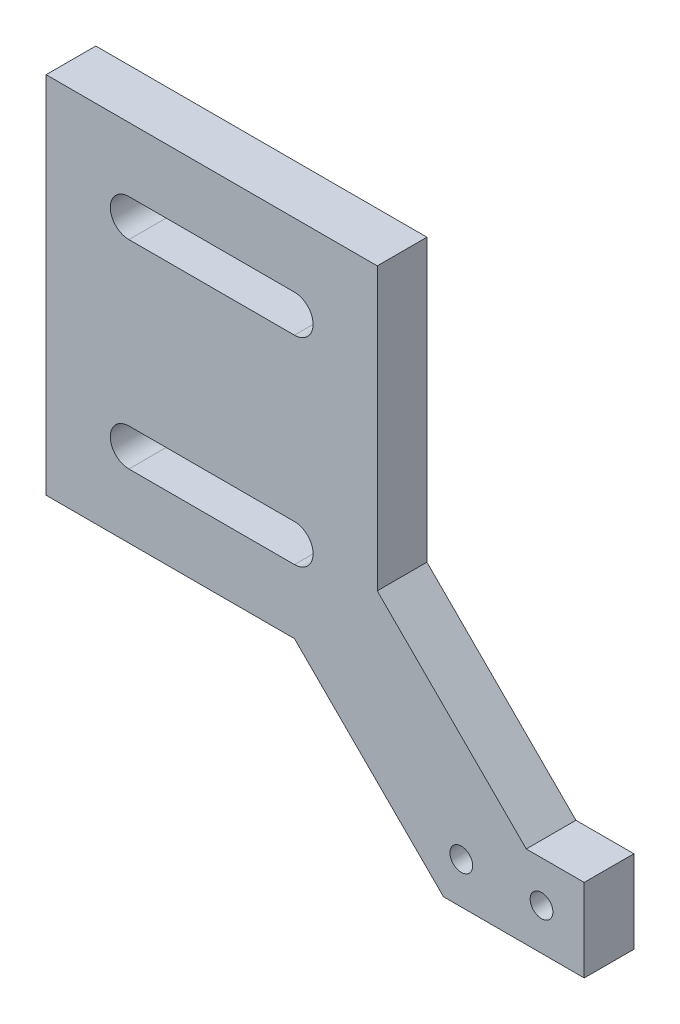
ISO-10303-21;
HEADER;
FILE_DESCRIPTION(('STEP AP214'),'2;1');
FILE_NAME('part.step','',(''),(''),'','','');
FILE_SCHEMA(('AUTOMOTIVE_DESIGN { 1 0 10303 214 1 1 1 1 }'));
ENDSEC;
DATA;
#1=APPLICATION_CONTEXT('core data for automotive mechanical design processes');
#2=APPLICATION_PROTOCOL_DEFINITION('international standard','automotive_design',2000,#1);
#3=PRODUCT_CONTEXT('',#1,'mechanical');
#4=PRODUCT('Part','Part','',(#3));
#5=PRODUCT_RELATED_PRODUCT_CATEGORY('part','',(#4));
#6=PRODUCT_DEFINITION_FORMATION('','',#4);
#7=PRODUCT_DEFINITION_CONTEXT('part definition',#1,'design');
#8=PRODUCT_DEFINITION('design','',#6,#7);
#9=PRODUCT_DEFINITION_SHAPE('','',#8);
#10=(LENGTH_UNIT() NAMED_UNIT(*) SI_UNIT(.MILLI.,.METRE.));
#11=(NAMED_UNIT(*) PLANE_ANGLE_UNIT() SI_UNIT($,.RADIAN.));
#12=(NAMED_UNIT(*) SI_UNIT($,.STERADIAN.) SOLID_ANGLE_UNIT());
#13=UNCERTAINTY_MEASURE_WITH_UNIT(LENGTH_MEASURE(1.E-05),#10,'distance_accuracy_value','');
#14=(GEOMETRIC_REPRESENTATION_CONTEXT(3) GLOBAL_UNCERTAINTY_ASSIGNED_CONTEXT((#13)) GLOBAL_UNIT_ASSIGNED_CONTEXT((#10,
#11,#12)) REPRESENTATION_CONTEXT('',''));
#15=CARTESIAN_POINT('',(0.,0.,0.));
#16=DIRECTION('',(0.,0.,1.));
#17=DIRECTION('',(1.,0.,0.));
#18=AXIS2_PLACEMENT_3D('',#15,#16,#17);
#19=CARTESIAN_POINT('',(0.,0.,6.));
#20=DIRECTION('',(0.,0.,-1.));
#21=DIRECTION('',(-1.,0.,0.));
#22=AXIS2_PLACEMENT_3D('',#19,#20,#21);
#23=PLANE('',#22);
#24=DIRECTION('',(1.,0.,0.));
#25=VECTOR('',#24,1.);
#26=CARTESIAN_POINT('',(20.,-22.,6.));
#27=LINE('',#26,#25);
#28=CARTESIAN_POINT('',(-20.,-22.,6.));
#29=VERTEX_POINT('',#28);
#30=CARTESIAN_POINT('',(10.,-22.,6.));
#31=VERTEX_POINT('',#30);
#32=EDGE_CURVE('E212',#29,#31,#27,.T.);
#33=ORIENTED_EDGE('',*,*,#32,.T.);
#34=DIRECTION('',(0.707106781186546,-0.707106781186549,0.));
#35=VECTOR('',#34,1.);
#36=CARTESIAN_POINT('',(27.9999999999999,-40.,6.));
#37=LINE('',#36,#35);
#38=CARTESIAN_POINT('',(27.9999999999999,-40.,6.));
#39=VERTEX_POINT('',#38);
#40=EDGE_CURVE('E236',#31,#39,#37,.T.);
#41=ORIENTED_EDGE('',*,*,#40,.T.);
#42=DIRECTION('',(1.,0.,0.));
#43=VECTOR('',#42,1.);
#44=CARTESIAN_POINT('',(45.,-40.,6.));
#45=LINE('',#44,#43);
#46=CARTESIAN_POINT('',(45.,-40.,6.));
#47=VERTEX_POINT('',#46);
#48=EDGE_CURVE('E573',#39,#47,#45,.T.);
#49=ORIENTED_EDGE('',*,*,#48,.T.);
#50=DIRECTION('',(0.,1.,0.));
#51=VECTOR('',#50,1.);
#52=CARTESIAN_POINT('',(45.,-30.,6.));
#53=LINE('',#52,#51);
#54=CARTESIAN_POINT('',(45.,-30.,6.));
#55=VERTEX_POINT('',#54);
#56=EDGE_CURVE('E251',#47,#55,#53,.T.);
#57=ORIENTED_EDGE('',*,*,#56,.T.);
#58=DIRECTION('',(-1.,0.,0.));
#59=VECTOR('',#58,1.);
#60=CARTESIAN_POINT('',(37.9999999999999,-30.,6.));
#61=LINE('',#60,#59);
#62=CARTESIAN_POINT('',(37.9999999999999,-30.,6.));
#63=VERTEX_POINT('',#62);
#64=EDGE_CURVE('E246',#55,#63,#61,.T.);
#65=ORIENTED_EDGE('',*,*,#64,.T.);
#66=DIRECTION('',(-0.707106781186546,0.707106781186549,0.));
#67=VECTOR('',#66,1.);
#68=CARTESIAN_POINT('',(20.,-12.,6.));
#69=LINE('',#68,#67);
#70=CARTESIAN_POINT('',(20.,-12.,6.));
#71=VERTEX_POINT('',#70);
#72=EDGE_CURVE('E270',#63,#71,#69,.T.);
#73=ORIENTED_EDGE('',*,*,#72,.T.);
#74=DIRECTION('',(0.,1.,0.));
#75=VECTOR('',#74,1.);
#76=CARTESIAN_POINT('',(20.,22.,6.));
#77=LINE('',#76,#75);
#78=CARTESIAN_POINT('',(20.,22.,6.));
#79=VERTEX_POINT('',#78);
#80=EDGE_CURVE('E176',#71,#79,#77,.T.);
#81=ORIENTED_EDGE('',*,*,#80,.T.);
#82=DIRECTION('',(-1.,0.,0.));
#83=VECTOR('',#82,1.);
#84=CARTESIAN_POINT('',(20.,22.,6.));
#85=LINE('',#84,#83);
#86=CARTESIAN_POINT('',(-20.,22.,6.));
#87=VERTEX_POINT('',#86);
#88=EDGE_CURVE('E200',#79,#87,#85,.T.);
#89=ORIENTED_EDGE('',*,*,#88,.T.);
#90=DIRECTION('',(0.,-1.,0.));
#91=VECTOR('',#90,1.);
#92=CARTESIAN_POINT('',(-20.,22.,6.));
#93=LINE('',#92,#91);
#94=EDGE_CURVE('E190',#87,#29,#93,.T.);
#95=ORIENTED_EDGE('',*,*,#94,.T.);
#96=EDGE_LOOP('',(#33,#41,#49,#57,#65,#73,#81,#89,#95));
#97=FACE_BOUND('',#96,.T.);
#98=CARTESIAN_POINT('',(-10.,-12.,6.));
#99=DIRECTION('',(0.,0.,1.));
#100=DIRECTION('',(1.,0.,0.));
#101=AXIS2_PLACEMENT_3D('',#98,#99,#100);
#102=CIRCLE('',#101,2.25);
#103=CARTESIAN_POINT('',(-10.,-9.75,6.));
#104=VERTEX_POINT('',#103);
#105=CARTESIAN_POINT('',(-10.,-14.25,6.));
#106=VERTEX_POINT('',#105);
#107=EDGE_CURVE('E313',#104,#106,#102,.T.);
#108=ORIENTED_EDGE('',*,*,#107,.F.);
#109=DIRECTION('',(-1.,0.,0.));
#110=VECTOR('',#109,1.);
#111=CARTESIAN_POINT('',(-10.,-9.75,6.));
#112=LINE('',#111,#110);
#113=CARTESIAN_POINT('',(10.,-9.75,6.));
#114=VERTEX_POINT('',#113);
#115=EDGE_CURVE('E324',#114,#104,#112,.T.);
#116=ORIENTED_EDGE('',*,*,#115,.F.);
#117=CARTESIAN_POINT('',(10.,-12.,6.));
#118=DIRECTION('',(0.,0.,1.));
#119=DIRECTION('',(1.,0.,0.));
#120=AXIS2_PLACEMENT_3D('',#117,#118,#119);
#121=CIRCLE('',#120,2.25);
#122=CARTESIAN_POINT('',(10.,-14.25,6.));
#123=VERTEX_POINT('',#122);
#124=EDGE_CURVE('E320',#123,#114,#121,.T.);
#125=ORIENTED_EDGE('',*,*,#124,.F.);
#126=DIRECTION('',(1.,0.,0.));
#127=VECTOR('',#126,1.);
#128=CARTESIAN_POINT('',(-10.,-14.25,6.));
#129=LINE('',#128,#127);
#130=EDGE_CURVE('E316',#106,#123,#129,.T.);
#131=ORIENTED_EDGE('',*,*,#130,.F.);
#132=EDGE_LOOP('',(#108,#116,#125,#131));
#133=FACE_BOUND('',#132,.T.);
#134=CARTESIAN_POINT('',(-10.,12.,6.));
#135=DIRECTION('',(0.,0.,1.));
#136=DIRECTION('',(1.,0.,0.));
#137=AXIS2_PLACEMENT_3D('',#134,#135,#136);
#138=CIRCLE('',#137,2.25);
#139=CARTESIAN_POINT('',(-10.,14.25,6.));
#140=VERTEX_POINT('',#139);
#141=CARTESIAN_POINT('',(-10.,9.75,6.));
#142=VERTEX_POINT('',#141);
#143=EDGE_CURVE('E271',#140,#142,#138,.T.);
#144=ORIENTED_EDGE('',*,*,#143,.F.);
#145=DIRECTION('',(-1.,0.,0.));
#146=VECTOR('',#145,1.);
#147=CARTESIAN_POINT('',(-10.,14.25,6.));
#148=LINE('',#147,#146);
#149=CARTESIAN_POINT('',(10.,14.25,6.));
#150=VERTEX_POINT('',#149);
#151=EDGE_CURVE('E281',#150,#140,#148,.T.);
#152=ORIENTED_EDGE('',*,*,#151,.F.);
#153=CARTESIAN_POINT('',(10.,12.,6.));
#154=DIRECTION('',(0.,0.,1.));
#155=DIRECTION('',(1.,0.,0.));
#156=AXIS2_PLACEMENT_3D('',#153,#154,#155);
#157=CIRCLE('',#156,2.25);
#158=CARTESIAN_POINT('',(10.,9.75,6.));
#159=VERTEX_POINT('',#158);
#160=EDGE_CURVE('E278',#159,#150,#157,.T.);
#161=ORIENTED_EDGE('',*,*,#160,.F.);
#162=DIRECTION('',(1.,0.,0.));
#163=VECTOR('',#162,1.);
#164=CARTESIAN_POINT('',(-10.,9.75,6.));
#165=LINE('',#164,#163);
#166=EDGE_CURVE('E274',#142,#159,#165,.T.);
#167=ORIENTED_EDGE('',*,*,#166,.F.);
#168=EDGE_LOOP('',(#144,#152,#161,#167));
#169=FACE_BOUND('',#168,.T.);
#170=CARTESIAN_POINT('',(30.155,-35.,6.));
#171=DIRECTION('',(0.,0.,-1.));
#172=DIRECTION('',(-1.,0.,0.));
#173=AXIS2_PLACEMENT_3D('',#170,#171,#172);
#174=CIRCLE('',#173,1.375);
#175=CARTESIAN_POINT('',(28.78,-35.,6.));
#176=VERTEX_POINT('',#175);
#177=EDGE_CURVE('E265',#176,#176,#174,.F.);
#178=ORIENTED_EDGE('',*,*,#177,.F.);
#179=EDGE_LOOP('',(#178));
#180=FACE_BOUND('',#179,.T.);
#181=CARTESIAN_POINT('',(39.845,-35.,6.));
#182=DIRECTION('',(0.,0.,-1.));
#183=DIRECTION('',(-1.,0.,0.));
#184=AXIS2_PLACEMENT_3D('',#181,#182,#183);
#185=CIRCLE('',#184,1.375);
#186=CARTESIAN_POINT('',(38.47,-35.,6.));
#187=VERTEX_POINT('',#186);
#188=EDGE_CURVE('E269',#187,#187,#185,.F.);
#189=ORIENTED_EDGE('',*,*,#188,.F.);
#190=EDGE_LOOP('',(#189));
#191=FACE_BOUND('',#190,.T.);
#192=ADVANCED_FACE('F39',(#97,#133,#169,#180,#191),#23,.F.);
#193=CARTESIAN_POINT('',(0.,0.,0.));
#194=DIRECTION('',(0.,0.,-1.));
#195=DIRECTION('',(-1.,0.,0.));
#196=AXIS2_PLACEMENT_3D('',#193,#194,#195);
#197=PLANE('',#196);
#198=DIRECTION('',(0.,-1.,0.));
#199=VECTOR('',#198,1.);
#200=CARTESIAN_POINT('',(-20.,22.,0.));
#201=LINE('',#200,#199);
#202=CARTESIAN_POINT('',(-20.,22.,0.));
#203=VERTEX_POINT('',#202);
#204=CARTESIAN_POINT('',(-20.,-22.,0.));
#205=VERTEX_POINT('',#204);
#206=EDGE_CURVE('E193',#203,#205,#201,.T.);
#207=ORIENTED_EDGE('',*,*,#206,.F.);
#208=DIRECTION('',(-1.,0.,0.));
#209=VECTOR('',#208,1.);
#210=CARTESIAN_POINT('',(20.,22.,0.));
#211=LINE('',#210,#209);
#212=CARTESIAN_POINT('',(20.,22.,0.));
#213=VERTEX_POINT('',#212);
#214=EDGE_CURVE('E184',#213,#203,#211,.T.);
#215=ORIENTED_EDGE('',*,*,#214,.F.);
#216=DIRECTION('',(0.,1.,0.));
#217=VECTOR('',#216,1.);
#218=CARTESIAN_POINT('',(20.,22.,0.));
#219=LINE('',#218,#217);
#220=CARTESIAN_POINT('',(20.,-12.,0.));
#221=VERTEX_POINT('',#220);
#222=EDGE_CURVE('E174',#221,#213,#219,.T.);
#223=ORIENTED_EDGE('',*,*,#222,.F.);
#224=DIRECTION('',(0.707106781186546,-0.707106781186549,0.));
#225=VECTOR('',#224,1.);
#226=CARTESIAN_POINT('',(20.,-12.,0.));
#227=LINE('',#226,#225);
#228=CARTESIAN_POINT('',(37.9999999999999,-30.,0.));
#229=VERTEX_POINT('',#228);
#230=EDGE_CURVE('E158',#221,#229,#227,.T.);
#231=ORIENTED_EDGE('',*,*,#230,.T.);
#232=DIRECTION('',(1.,0.,0.));
#233=VECTOR('',#232,1.);
#234=CARTESIAN_POINT('',(37.9999999999999,-30.,0.));
#235=LINE('',#234,#233);
#236=CARTESIAN_POINT('',(45.,-30.,0.));
#237=VERTEX_POINT('',#236);
#238=EDGE_CURVE('E167',#229,#237,#235,.T.);
#239=ORIENTED_EDGE('',*,*,#238,.T.);
#240=DIRECTION('',(0.,-1.,0.));
#241=VECTOR('',#240,1.);
#242=CARTESIAN_POINT('',(45.,-30.,0.));
#243=LINE('',#242,#241);
#244=CARTESIAN_POINT('',(45.,-40.,0.));
#245=VERTEX_POINT('',#244);
#246=EDGE_CURVE('E587',#237,#245,#243,.T.);
#247=ORIENTED_EDGE('',*,*,#246,.T.);
#248=DIRECTION('',(-1.,0.,0.));
#249=VECTOR('',#248,1.);
#250=CARTESIAN_POINT('',(45.,-40.,0.));
#251=LINE('',#250,#249);
#252=CARTESIAN_POINT('',(27.9999999999999,-40.,0.));
#253=VERTEX_POINT('',#252);
#254=EDGE_CURVE('E590',#245,#253,#251,.T.);
#255=ORIENTED_EDGE('',*,*,#254,.T.);
#256=DIRECTION('',(-0.707106781186546,0.707106781186549,0.));
#257=VECTOR('',#256,1.);
#258=CARTESIAN_POINT('',(27.9999999999999,-40.,0.));
#259=LINE('',#258,#257);
#260=CARTESIAN_POINT('',(10.,-22.,0.));
#261=VERTEX_POINT('',#260);
#262=EDGE_CURVE('E178',#253,#261,#259,.T.);
#263=ORIENTED_EDGE('',*,*,#262,.T.);
#264=DIRECTION('',(1.,0.,0.));
#265=VECTOR('',#264,1.);
#266=CARTESIAN_POINT('',(20.,-22.,0.));
#267=LINE('',#266,#265);
#268=EDGE_CURVE('E186',#205,#261,#267,.T.);
#269=ORIENTED_EDGE('',*,*,#268,.F.);
#270=EDGE_LOOP('',(#207,#215,#223,#231,#239,#247,#255,#263,#269));
#271=FACE_BOUND('',#270,.T.);
#272=DIRECTION('',(-1.,0.,0.));
#273=VECTOR('',#272,1.);
#274=CARTESIAN_POINT('',(-10.,-9.75,0.));
#275=LINE('',#274,#273);
#276=CARTESIAN_POINT('',(10.,-9.75,0.));
#277=VERTEX_POINT('',#276);
#278=CARTESIAN_POINT('',(-10.,-9.75,0.));
#279=VERTEX_POINT('',#278);
#280=EDGE_CURVE('E317',#277,#279,#275,.T.);
#281=ORIENTED_EDGE('',*,*,#280,.T.);
#282=CARTESIAN_POINT('',(-10.,-12.,0.));
#283=DIRECTION('',(0.,0.,1.));
#284=DIRECTION('',(1.,0.,0.));
#285=AXIS2_PLACEMENT_3D('',#282,#283,#284);
#286=CIRCLE('',#285,2.25);
#287=CARTESIAN_POINT('',(-10.,-14.25,0.));
#288=VERTEX_POINT('',#287);
#289=EDGE_CURVE('E312',#279,#288,#286,.T.);
#290=ORIENTED_EDGE('',*,*,#289,.T.);
#291=DIRECTION('',(1.,0.,0.));
#292=VECTOR('',#291,1.);
#293=CARTESIAN_POINT('',(-10.,-14.25,0.));
#294=LINE('',#293,#292);
#295=CARTESIAN_POINT('',(10.,-14.25,0.));
#296=VERTEX_POINT('',#295);
#297=EDGE_CURVE('E330',#288,#296,#294,.T.);
#298=ORIENTED_EDGE('',*,*,#297,.T.);
#299=CARTESIAN_POINT('',(10.,-12.,0.));
#300=DIRECTION('',(0.,0.,1.));
#301=DIRECTION('',(1.,0.,0.));
#302=AXIS2_PLACEMENT_3D('',#299,#300,#301);
#303=CIRCLE('',#302,2.25);
#304=EDGE_CURVE('E334',#296,#277,#303,.T.);
#305=ORIENTED_EDGE('',*,*,#304,.T.);
#306=EDGE_LOOP('',(#281,#290,#298,#305));
#307=FACE_BOUND('',#306,.T.);
#308=DIRECTION('',(-1.,0.,0.));
#309=VECTOR('',#308,1.);
#310=CARTESIAN_POINT('',(-10.,14.25,0.));
#311=LINE('',#310,#309);
#312=CARTESIAN_POINT('',(10.,14.25,0.));
#313=VERTEX_POINT('',#312);
#314=CARTESIAN_POINT('',(-10.,14.25,0.));
#315=VERTEX_POINT('',#314);
#316=EDGE_CURVE('E275',#313,#315,#311,.T.);
#317=ORIENTED_EDGE('',*,*,#316,.T.);
#318=CARTESIAN_POINT('',(-10.,12.,0.));
#319=DIRECTION('',(0.,0.,1.));
#320=DIRECTION('',(1.,0.,0.));
#321=AXIS2_PLACEMENT_3D('',#318,#319,#320);
#322=CIRCLE('',#321,2.25);
#323=CARTESIAN_POINT('',(-10.,9.75,0.));
#324=VERTEX_POINT('',#323);
#325=EDGE_CURVE('E285',#315,#324,#322,.T.);
#326=ORIENTED_EDGE('',*,*,#325,.T.);
#327=DIRECTION('',(1.,0.,0.));
#328=VECTOR('',#327,1.);
#329=CARTESIAN_POINT('',(-10.,9.75,0.));
#330=LINE('',#329,#328);
#331=CARTESIAN_POINT('',(10.,9.75,0.));
#332=VERTEX_POINT('',#331);
#333=EDGE_CURVE('E289',#324,#332,#330,.T.);
#334=ORIENTED_EDGE('',*,*,#333,.T.);
#335=CARTESIAN_POINT('',(10.,12.,0.));
#336=DIRECTION('',(0.,0.,1.));
#337=DIRECTION('',(1.,0.,0.));
#338=AXIS2_PLACEMENT_3D('',#335,#336,#337);
#339=CIRCLE('',#338,2.25);
#340=EDGE_CURVE('E293',#332,#313,#339,.T.);
#341=ORIENTED_EDGE('',*,*,#340,.T.);
#342=EDGE_LOOP('',(#317,#326,#334,#341));
#343=FACE_BOUND('',#342,.T.);
#344=CARTESIAN_POINT('',(30.155,-35.,0.));
#345=DIRECTION('',(0.,0.,-1.));
#346=DIRECTION('',(-1.,0.,0.));
#347=AXIS2_PLACEMENT_3D('',#344,#345,#346);
#348=CIRCLE('',#347,1.375);
#349=CARTESIAN_POINT('',(28.78,-35.,0.));
#350=VERTEX_POINT('',#349);
#351=EDGE_CURVE('E578',#350,#350,#348,.T.);
#352=ORIENTED_EDGE('',*,*,#351,.F.);
#353=EDGE_LOOP('',(#352));
#354=FACE_BOUND('',#353,.T.);
#355=CARTESIAN_POINT('',(39.845,-35.,0.));
#356=DIRECTION('',(0.,0.,-1.));
#357=DIRECTION('',(-1.,0.,0.));
#358=AXIS2_PLACEMENT_3D('',#355,#356,#357);
#359=CIRCLE('',#358,1.375);
#360=CARTESIAN_POINT('',(38.47,-35.,0.));
#361=VERTEX_POINT('',#360);
#362=EDGE_CURVE('E168',#361,#361,#359,.T.);
#363=ORIENTED_EDGE('',*,*,#362,.F.);
#364=EDGE_LOOP('',(#363));
#365=FACE_BOUND('',#364,.T.);
#366=ADVANCED_FACE('F182',(#271,#307,#343,#354,#365),#197,.T.);
#367=CARTESIAN_POINT('',(-20.,22.,6.));
#368=DIRECTION('',(1.,0.,0.));
#369=DIRECTION('',(0.,1.,0.));
#370=AXIS2_PLACEMENT_3D('',#367,#368,#369);
#371=PLANE('',#370);
#372=ORIENTED_EDGE('',*,*,#206,.T.);
#373=DIRECTION('',(0.,0.,-1.));
#374=VECTOR('',#373,1.);
#375=CARTESIAN_POINT('',(-20.,-22.,6.));
#376=LINE('',#375,#374);
#377=EDGE_CURVE('E11',#29,#205,#376,.T.);
#378=ORIENTED_EDGE('',*,*,#377,.F.);
#379=ORIENTED_EDGE('',*,*,#94,.F.);
#380=DIRECTION('',(0.,0.,-1.));
#381=VECTOR('',#380,1.);
#382=CARTESIAN_POINT('',(-20.,22.,6.));
#383=LINE('',#382,#381);
#384=EDGE_CURVE('E197',#87,#203,#383,.T.);
#385=ORIENTED_EDGE('',*,*,#384,.T.);
#386=EDGE_LOOP('',(#372,#378,#379,#385));
#387=FACE_BOUND('',#386,.T.);
#388=ADVANCED_FACE('F41',(#387),#371,.F.);
#389=CARTESIAN_POINT('',(20.,-22.,6.));
#390=DIRECTION('',(0.,1.,0.));
#391=DIRECTION('',(-1.,0.,0.));
#392=AXIS2_PLACEMENT_3D('',#389,#390,#391);
#393=PLANE('',#392);
#394=ORIENTED_EDGE('',*,*,#268,.T.);
#395=DIRECTION('',(0.,0.,-1.));
#396=VECTOR('',#395,1.);
#397=CARTESIAN_POINT('',(10.,-22.,50.8218696620299));
#398=LINE('',#397,#396);
#399=EDGE_CURVE('E241',#31,#261,#398,.T.);
#400=ORIENTED_EDGE('',*,*,#399,.F.);
#401=ORIENTED_EDGE('',*,*,#32,.F.);
#402=ORIENTED_EDGE('',*,*,#377,.T.);
#403=EDGE_LOOP('',(#394,#400,#401,#402));
#404=FACE_BOUND('',#403,.T.);
#405=ADVANCED_FACE('F240',(#404),#393,.F.);
#406=CARTESIAN_POINT('',(20.,22.,6.));
#407=DIRECTION('',(-1.,0.,0.));
#408=DIRECTION('',(0.,-1.,0.));
#409=AXIS2_PLACEMENT_3D('',#406,#407,#408);
#410=PLANE('',#409);
#411=ORIENTED_EDGE('',*,*,#80,.F.);
#412=DIRECTION('',(0.,0.,-1.));
#413=VECTOR('',#412,1.);
#414=CARTESIAN_POINT('',(20.,-12.,50.8218696620299));
#415=LINE('',#414,#413);
#416=EDGE_CURVE('E55',#71,#221,#415,.T.);
#417=ORIENTED_EDGE('',*,*,#416,.T.);
#418=ORIENTED_EDGE('',*,*,#222,.T.);
#419=DIRECTION('',(0.,0.,-1.));
#420=VECTOR('',#419,1.);
#421=CARTESIAN_POINT('',(20.,22.,6.));
#422=LINE('',#421,#420);
#423=EDGE_CURVE('E48',#79,#213,#422,.T.);
#424=ORIENTED_EDGE('',*,*,#423,.F.);
#425=EDGE_LOOP('',(#411,#417,#418,#424));
#426=FACE_BOUND('',#425,.T.);
#427=ADVANCED_FACE('F172',(#426),#410,.F.);
#428=CARTESIAN_POINT('',(20.,22.,6.));
#429=DIRECTION('',(0.,-1.,0.));
#430=DIRECTION('',(1.,0.,0.));
#431=AXIS2_PLACEMENT_3D('',#428,#429,#430);
#432=PLANE('',#431);
#433=ORIENTED_EDGE('',*,*,#214,.T.);
#434=ORIENTED_EDGE('',*,*,#384,.F.);
#435=ORIENTED_EDGE('',*,*,#88,.F.);
#436=ORIENTED_EDGE('',*,*,#423,.T.);
#437=EDGE_LOOP('',(#433,#434,#435,#436));
#438=FACE_BOUND('',#437,.T.);
#439=ADVANCED_FACE('F204',(#438),#432,.F.);
#440=CARTESIAN_POINT('',(-10.,-12.,6.));
#441=DIRECTION('',(0.,0.,-1.));
#442=DIRECTION('',(-1.,0.,0.));
#443=AXIS2_PLACEMENT_3D('',#440,#441,#442);
#444=CYLINDRICAL_SURFACE('',#443,2.25);
#445=ORIENTED_EDGE('',*,*,#289,.F.);
#446=DIRECTION('',(0.,0.,-1.));
#447=VECTOR('',#446,1.);
#448=CARTESIAN_POINT('',(-10.,-9.75,6.));
#449=LINE('',#448,#447);
#450=EDGE_CURVE('E327',#104,#279,#449,.T.);
#451=ORIENTED_EDGE('',*,*,#450,.F.);
#452=ORIENTED_EDGE('',*,*,#107,.T.);
#453=DIRECTION('',(0.,0.,-1.));
#454=VECTOR('',#453,1.);
#455=CARTESIAN_POINT('',(-10.,-14.25,6.));
#456=LINE('',#455,#454);
#457=EDGE_CURVE('E217',#106,#288,#456,.T.);
#458=ORIENTED_EDGE('',*,*,#457,.T.);
#459=EDGE_LOOP('',(#445,#451,#452,#458));
#460=FACE_BOUND('',#459,.T.);
#461=ADVANCED_FACE('F360',(#460),#444,.F.);
#462=CARTESIAN_POINT('',(-10.,-14.25,6.));
#463=DIRECTION('',(0.,1.,0.));
#464=DIRECTION('',(-1.,0.,0.));
#465=AXIS2_PLACEMENT_3D('',#462,#463,#464);
#466=PLANE('',#465);
#467=ORIENTED_EDGE('',*,*,#297,.F.);
#468=ORIENTED_EDGE('',*,*,#457,.F.);
#469=ORIENTED_EDGE('',*,*,#130,.T.);
#470=DIRECTION('',(0.,0.,-1.));
#471=VECTOR('',#470,1.);
#472=CARTESIAN_POINT('',(10.,-14.25,6.));
#473=LINE('',#472,#471);
#474=EDGE_CURVE('E222',#123,#296,#473,.T.);
#475=ORIENTED_EDGE('',*,*,#474,.T.);
#476=EDGE_LOOP('',(#467,#468,#469,#475));
#477=FACE_BOUND('',#476,.T.);
#478=ADVANCED_FACE('F356',(#477),#466,.T.);
#479=CARTESIAN_POINT('',(10.,-12.,6.));
#480=DIRECTION('',(0.,0.,-1.));
#481=DIRECTION('',(-1.,0.,0.));
#482=AXIS2_PLACEMENT_3D('',#479,#480,#481);
#483=CYLINDRICAL_SURFACE('',#482,2.25);
#484=ORIENTED_EDGE('',*,*,#304,.F.);
#485=ORIENTED_EDGE('',*,*,#474,.F.);
#486=ORIENTED_EDGE('',*,*,#124,.T.);
#487=DIRECTION('',(0.,0.,-1.));
#488=VECTOR('',#487,1.);
#489=CARTESIAN_POINT('',(10.,-9.75,6.));
#490=LINE('',#489,#488);
#491=EDGE_CURVE('E228',#114,#277,#490,.T.);
#492=ORIENTED_EDGE('',*,*,#491,.T.);
#493=EDGE_LOOP('',(#484,#485,#486,#492));
#494=FACE_BOUND('',#493,.T.);
#495=ADVANCED_FACE('F347',(#494),#483,.F.);
#496=CARTESIAN_POINT('',(-10.,-9.75,6.));
#497=DIRECTION('',(0.,-1.,0.));
#498=DIRECTION('',(1.,0.,0.));
#499=AXIS2_PLACEMENT_3D('',#496,#497,#498);
#500=PLANE('',#499);
#501=ORIENTED_EDGE('',*,*,#280,.F.);
#502=ORIENTED_EDGE('',*,*,#491,.F.);
#503=ORIENTED_EDGE('',*,*,#115,.T.);
#504=ORIENTED_EDGE('',*,*,#450,.T.);
#505=EDGE_LOOP('',(#501,#502,#503,#504));
#506=FACE_BOUND('',#505,.T.);
#507=ADVANCED_FACE('F352',(#506),#500,.T.);
#508=CARTESIAN_POINT('',(-10.,12.,6.));
#509=DIRECTION('',(0.,0.,-1.));
#510=DIRECTION('',(-1.,0.,0.));
#511=AXIS2_PLACEMENT_3D('',#508,#509,#510);
#512=CYLINDRICAL_SURFACE('',#511,2.25);
#513=ORIENTED_EDGE('',*,*,#325,.F.);
#514=DIRECTION('',(0.,0.,-1.));
#515=VECTOR('',#514,1.);
#516=CARTESIAN_POINT('',(-10.,14.25,6.));
#517=LINE('',#516,#515);
#518=EDGE_CURVE('E284',#140,#315,#517,.T.);
#519=ORIENTED_EDGE('',*,*,#518,.F.);
#520=ORIENTED_EDGE('',*,*,#143,.T.);
#521=DIRECTION('',(0.,0.,-1.));
#522=VECTOR('',#521,1.);
#523=CARTESIAN_POINT('',(-10.,9.75,6.));
#524=LINE('',#523,#522);
#525=EDGE_CURVE('E308',#142,#324,#524,.T.);
#526=ORIENTED_EDGE('',*,*,#525,.T.);
#527=EDGE_LOOP('',(#513,#519,#520,#526));
#528=FACE_BOUND('',#527,.T.);
#529=ADVANCED_FACE('F486',(#528),#512,.F.);
#530=CARTESIAN_POINT('',(-10.,9.75,6.));
#531=DIRECTION('',(0.,1.,0.));
#532=DIRECTION('',(-1.,0.,0.));
#533=AXIS2_PLACEMENT_3D('',#530,#531,#532);
#534=PLANE('',#533);
#535=ORIENTED_EDGE('',*,*,#333,.F.);
#536=ORIENTED_EDGE('',*,*,#525,.F.);
#537=ORIENTED_EDGE('',*,*,#166,.T.);
#538=DIRECTION('',(0.,0.,-1.));
#539=VECTOR('',#538,1.);
#540=CARTESIAN_POINT('',(10.,9.75,6.));
#541=LINE('',#540,#539);
#542=EDGE_CURVE('E305',#159,#332,#541,.T.);
#543=ORIENTED_EDGE('',*,*,#542,.T.);
#544=EDGE_LOOP('',(#535,#536,#537,#543));
#545=FACE_BOUND('',#544,.T.);
#546=ADVANCED_FACE('F482',(#545),#534,.T.);
#547=CARTESIAN_POINT('',(10.,12.,6.));
#548=DIRECTION('',(0.,0.,-1.));
#549=DIRECTION('',(-1.,0.,0.));
#550=AXIS2_PLACEMENT_3D('',#547,#548,#549);
#551=CYLINDRICAL_SURFACE('',#550,2.25);
#552=ORIENTED_EDGE('',*,*,#340,.F.);
#553=ORIENTED_EDGE('',*,*,#542,.F.);
#554=ORIENTED_EDGE('',*,*,#160,.T.);
#555=DIRECTION('',(0.,0.,-1.));
#556=VECTOR('',#555,1.);
#557=CARTESIAN_POINT('',(10.,14.25,6.));
#558=LINE('',#557,#556);
#559=EDGE_CURVE('E63',#150,#313,#558,.T.);
#560=ORIENTED_EDGE('',*,*,#559,.T.);
#561=EDGE_LOOP('',(#552,#553,#554,#560));
#562=FACE_BOUND('',#561,.T.);
#563=ADVANCED_FACE('F479',(#562),#551,.F.);
#564=CARTESIAN_POINT('',(-10.,14.25,6.));
#565=DIRECTION('',(0.,-1.,0.));
#566=DIRECTION('',(1.,0.,0.));
#567=AXIS2_PLACEMENT_3D('',#564,#565,#566);
#568=PLANE('',#567);
#569=ORIENTED_EDGE('',*,*,#316,.F.);
#570=ORIENTED_EDGE('',*,*,#559,.F.);
#571=ORIENTED_EDGE('',*,*,#151,.T.);
#572=ORIENTED_EDGE('',*,*,#518,.T.);
#573=EDGE_LOOP('',(#569,#570,#571,#572));
#574=FACE_BOUND('',#573,.T.);
#575=ADVANCED_FACE('F413',(#574),#568,.T.);
#576=CARTESIAN_POINT('',(20.,-12.,50.8218696620299));
#577=DIRECTION('',(0.707106781186549,0.707106781186546,0.));
#578=DIRECTION('',(-0.707106781186546,0.707106781186549,0.));
#579=AXIS2_PLACEMENT_3D('',#576,#577,#578);
#580=PLANE('',#579);
#581=ORIENTED_EDGE('',*,*,#72,.F.);
#582=DIRECTION('',(0.,0.,-1.));
#583=VECTOR('',#582,1.);
#584=CARTESIAN_POINT('',(37.9999999999999,-30.,50.8218696620299));
#585=LINE('',#584,#583);
#586=EDGE_CURVE('E161',#63,#229,#585,.T.);
#587=ORIENTED_EDGE('',*,*,#586,.T.);
#588=ORIENTED_EDGE('',*,*,#230,.F.);
#589=ORIENTED_EDGE('',*,*,#416,.F.);
#590=EDGE_LOOP('',(#581,#587,#588,#589));
#591=FACE_BOUND('',#590,.T.);
#592=ADVANCED_FACE('F159',(#591),#580,.T.);
#593=CARTESIAN_POINT('',(37.9999999999999,-30.,50.8218696620299));
#594=DIRECTION('',(0.,1.,0.));
#595=DIRECTION('',(0.,0.,1.));
#596=AXIS2_PLACEMENT_3D('',#593,#594,#595);
#597=PLANE('',#596);
#598=ORIENTED_EDGE('',*,*,#64,.F.);
#599=DIRECTION('',(0.,0.,-1.));
#600=VECTOR('',#599,1.);
#601=CARTESIAN_POINT('',(45.,-30.,50.8218696620299));
#602=LINE('',#601,#600);
#603=EDGE_CURVE('E260',#55,#237,#602,.T.);
#604=ORIENTED_EDGE('',*,*,#603,.T.);
#605=ORIENTED_EDGE('',*,*,#238,.F.);
#606=ORIENTED_EDGE('',*,*,#586,.F.);
#607=EDGE_LOOP('',(#598,#604,#605,#606));
#608=FACE_BOUND('',#607,.T.);
#609=ADVANCED_FACE('F412',(#608),#597,.T.);
#610=CARTESIAN_POINT('',(45.,-30.,50.8218696620299));
#611=DIRECTION('',(1.,0.,0.));
#612=DIRECTION('',(0.,0.,-1.));
#613=AXIS2_PLACEMENT_3D('',#610,#611,#612);
#614=PLANE('',#613);
#615=ORIENTED_EDGE('',*,*,#56,.F.);
#616=DIRECTION('',(0.,0.,-1.));
#617=VECTOR('',#616,1.);
#618=CARTESIAN_POINT('',(45.,-40.,50.8218696620299));
#619=LINE('',#618,#617);
#620=EDGE_CURVE('E253',#47,#245,#619,.T.);
#621=ORIENTED_EDGE('',*,*,#620,.T.);
#622=ORIENTED_EDGE('',*,*,#246,.F.);
#623=ORIENTED_EDGE('',*,*,#603,.F.);
#624=EDGE_LOOP('',(#615,#621,#622,#623));
#625=FACE_BOUND('',#624,.T.);
#626=ADVANCED_FACE('F423',(#625),#614,.T.);
#627=CARTESIAN_POINT('',(45.,-40.,50.8218696620299));
#628=DIRECTION('',(0.,-1.,0.));
#629=DIRECTION('',(0.,0.,-1.));
#630=AXIS2_PLACEMENT_3D('',#627,#628,#629);
#631=PLANE('',#630);
#632=ORIENTED_EDGE('',*,*,#48,.F.);
#633=DIRECTION('',(0.,0.,-1.));
#634=VECTOR('',#633,1.);
#635=CARTESIAN_POINT('',(27.9999999999999,-40.,50.8218696620299));
#636=LINE('',#635,#634);
#637=EDGE_CURVE('E247',#39,#253,#636,.T.);
#638=ORIENTED_EDGE('',*,*,#637,.T.);
#639=ORIENTED_EDGE('',*,*,#254,.F.);
#640=ORIENTED_EDGE('',*,*,#620,.F.);
#641=EDGE_LOOP('',(#632,#638,#639,#640));
#642=FACE_BOUND('',#641,.T.);
#643=ADVANCED_FACE('F433',(#642),#631,.T.);
#644=CARTESIAN_POINT('',(27.9999999999999,-40.,50.8218696620299));
#645=DIRECTION('',(-0.707106781186549,-0.707106781186546,0.));
#646=DIRECTION('',(0.707106781186546,-0.707106781186549,0.));
#647=AXIS2_PLACEMENT_3D('',#644,#645,#646);
#648=PLANE('',#647);
#649=ORIENTED_EDGE('',*,*,#40,.F.);
#650=ORIENTED_EDGE('',*,*,#399,.T.);
#651=ORIENTED_EDGE('',*,*,#262,.F.);
#652=ORIENTED_EDGE('',*,*,#637,.F.);
#653=EDGE_LOOP('',(#649,#650,#651,#652));
#654=FACE_BOUND('',#653,.T.);
#655=ADVANCED_FACE('F443',(#654),#648,.T.);
#656=CARTESIAN_POINT('',(39.845,-35.,50.8218696620299));
#657=DIRECTION('',(0.,0.,-1.));
#658=DIRECTION('',(-1.,0.,0.));
#659=AXIS2_PLACEMENT_3D('',#656,#657,#658);
#660=CYLINDRICAL_SURFACE('',#659,1.375);
#661=ORIENTED_EDGE('',*,*,#188,.T.);
#662=EDGE_LOOP('',(#661));
#663=FACE_BOUND('',#662,.T.);
#664=ORIENTED_EDGE('',*,*,#362,.T.);
#665=EDGE_LOOP('',(#664));
#666=FACE_BOUND('',#665,.T.);
#667=ADVANCED_FACE('F453',(#663,#666),#660,.F.);
#668=CARTESIAN_POINT('',(30.155,-35.,50.8218696620299));
#669=DIRECTION('',(0.,0.,-1.));
#670=DIRECTION('',(-1.,0.,0.));
#671=AXIS2_PLACEMENT_3D('',#668,#669,#670);
#672=CYLINDRICAL_SURFACE('',#671,1.375);
#673=ORIENTED_EDGE('',*,*,#177,.T.);
#674=EDGE_LOOP('',(#673));
#675=FACE_BOUND('',#674,.T.);
#676=ORIENTED_EDGE('',*,*,#351,.T.);
#677=EDGE_LOOP('',(#676));
#678=FACE_BOUND('',#677,.T.);
#679=ADVANCED_FACE('F462',(#675,#678),#672,.F.);
#680=CLOSED_SHELL('',(#192,#366,#388,#405,#427,#439,#461,#478,#495,#507,#529,#546,#563,#575,
#592,#609,#626,#643,#655,#667,#679));
#681=MANIFOLD_SOLID_BREP('B2',#680);
#682=ADVANCED_BREP_SHAPE_REPRESENTATION('',(#18,#681),#14);
#683=SHAPE_DEFINITION_REPRESENTATION(#9,#682);
ENDSEC;
END-ISO-10303-21;
